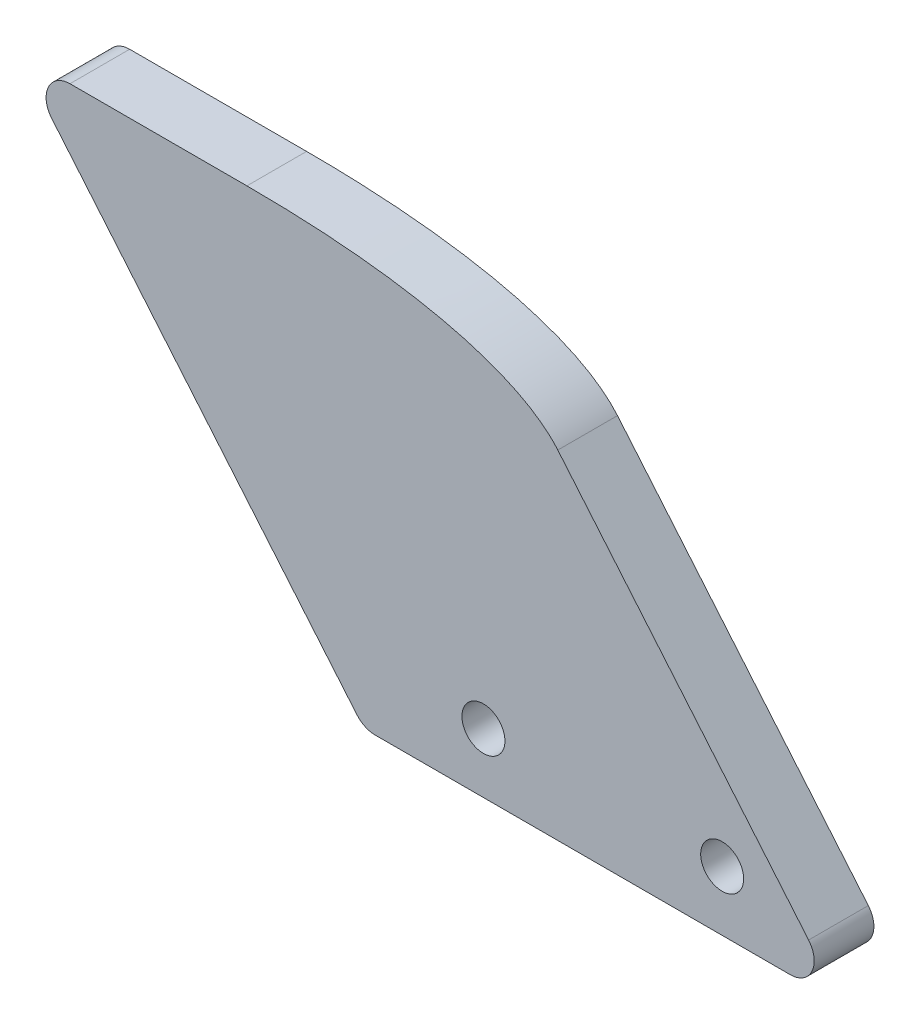
ISO-10303-21;
HEADER;
FILE_DESCRIPTION(('STEP AP214'),'2;1');
FILE_NAME('part.step','',(''),(''),'','','');
FILE_SCHEMA(('AUTOMOTIVE_DESIGN { 1 0 10303 214 1 1 1 1 }'));
ENDSEC;
DATA;
#1=APPLICATION_CONTEXT('core data for automotive mechanical design processes');
#2=APPLICATION_PROTOCOL_DEFINITION('international standard','automotive_design',2000,#1);
#3=PRODUCT_CONTEXT('',#1,'mechanical');
#4=PRODUCT('Part','Part','',(#3));
#5=PRODUCT_RELATED_PRODUCT_CATEGORY('part','',(#4));
#6=PRODUCT_DEFINITION_FORMATION('','',#4);
#7=PRODUCT_DEFINITION_CONTEXT('part definition',#1,'design');
#8=PRODUCT_DEFINITION('design','',#6,#7);
#9=PRODUCT_DEFINITION_SHAPE('','',#8);
#10=(LENGTH_UNIT() NAMED_UNIT(*) SI_UNIT(.MILLI.,.METRE.));
#11=(NAMED_UNIT(*) PLANE_ANGLE_UNIT() SI_UNIT($,.RADIAN.));
#12=(NAMED_UNIT(*) SI_UNIT($,.STERADIAN.) SOLID_ANGLE_UNIT());
#13=UNCERTAINTY_MEASURE_WITH_UNIT(LENGTH_MEASURE(1.E-05),#10,'distance_accuracy_value','');
#14=(GEOMETRIC_REPRESENTATION_CONTEXT(3) GLOBAL_UNCERTAINTY_ASSIGNED_CONTEXT((#13)) GLOBAL_UNIT_ASSIGNED_CONTEXT((#10,
#11,#12)) REPRESENTATION_CONTEXT('',''));
#15=CARTESIAN_POINT('',(0.,0.,0.));
#16=DIRECTION('',(0.,0.,1.));
#17=DIRECTION('',(1.,0.,0.));
#18=AXIS2_PLACEMENT_3D('',#15,#16,#17);
#19=CARTESIAN_POINT('',(36.7353118935856,-43.7794399242497,6.35));
#20=DIRECTION('',(0.766044443118979,0.642787609686538,0.));
#21=DIRECTION('',(-0.642787609686538,0.766044443118979,0.));
#22=AXIS2_PLACEMENT_3D('',#19,#20,#21);
#23=PLANE('',#22);
#24=DIRECTION('',(0.642787609686538,-0.766044443118979,0.));
#25=VECTOR('',#24,1.);
#26=CARTESIAN_POINT('',(36.7353118935856,-43.7794399242497,6.35));
#27=LINE('',#26,#25);
#28=CARTESIAN_POINT('',(3.50129469257206,-4.1726805286038,6.35));
#29=VERTEX_POINT('',#28);
#30=CARTESIAN_POINT('',(35.9739804597771,-42.8721204528535,6.35));
#31=VERTEX_POINT('',#30);
#32=EDGE_CURVE('E148',#29,#31,#27,.T.);
#33=ORIENTED_EDGE('',*,*,#32,.F.);
#34=DIRECTION('',(0.,0.,-1.));
#35=VECTOR('',#34,1.);
#36=CARTESIAN_POINT('',(3.50129469257206,-4.1726805286038,6.35));
#37=LINE('',#36,#35);
#38=CARTESIAN_POINT('',(3.50129469257206,-4.1726805286038,0.));
#39=VERTEX_POINT('',#38);
#40=EDGE_CURVE('E57',#29,#39,#37,.T.);
#41=ORIENTED_EDGE('',*,*,#40,.T.);
#42=DIRECTION('',(0.642787609686538,-0.766044443118979,0.));
#43=VECTOR('',#42,1.);
#44=CARTESIAN_POINT('',(36.7353118935856,-43.7794399242497,0.));
#45=LINE('',#44,#43);
#46=CARTESIAN_POINT('',(35.9739804597771,-42.8721204528535,0.));
#47=VERTEX_POINT('',#46);
#48=EDGE_CURVE('E168',#39,#47,#45,.T.);
#49=ORIENTED_EDGE('',*,*,#48,.T.);
#50=DIRECTION('',(0.,0.,-1.));
#51=VECTOR('',#50,1.);
#52=CARTESIAN_POINT('',(35.9739804597771,-42.8721204528535,6.35));
#53=LINE('',#52,#51);
#54=EDGE_CURVE('E64',#47,#31,#53,.F.);
#55=ORIENTED_EDGE('',*,*,#54,.T.);
#56=EDGE_LOOP('',(#33,#41,#49,#55));
#57=FACE_BOUND('',#56,.T.);
#58=ADVANCED_FACE('F48',(#57),#23,.F.);
#59=CARTESIAN_POINT('',(87.5353118935856,-43.7794399242497,6.35));
#60=DIRECTION('',(0.,1.,0.));
#61=DIRECTION('',(-1.,0.,0.));
#62=AXIS2_PLACEMENT_3D('',#59,#60,#61);
#63=PLANE('',#62);
#64=DIRECTION('',(1.,0.,0.));
#65=VECTOR('',#64,1.);
#66=CARTESIAN_POINT('',(87.5353118935856,-43.7794399242497,0.));
#67=LINE('',#66,#65);
#68=CARTESIAN_POINT('',(37.9197333452993,-43.7794399242497,0.));
#69=VERTEX_POINT('',#68);
#70=CARTESIAN_POINT('',(82.0882643154914,-43.7794399242497,0.));
#71=VERTEX_POINT('',#70);
#72=EDGE_CURVE('E155',#69,#71,#67,.T.);
#73=ORIENTED_EDGE('',*,*,#72,.T.);
#74=DIRECTION('',(0.,0.,-1.));
#75=VECTOR('',#74,1.);
#76=CARTESIAN_POINT('',(82.0882643154914,-43.7794399242497,6.35));
#77=LINE('',#76,#75);
#78=CARTESIAN_POINT('',(82.0882643154914,-43.7794399242497,6.35));
#79=VERTEX_POINT('',#78);
#80=EDGE_CURVE('E198',#71,#79,#77,.F.);
#81=ORIENTED_EDGE('',*,*,#80,.T.);
#82=DIRECTION('',(1.,0.,0.));
#83=VECTOR('',#82,1.);
#84=CARTESIAN_POINT('',(87.5353118935856,-43.7794399242497,6.35));
#85=LINE('',#84,#83);
#86=CARTESIAN_POINT('',(37.9197333452993,-43.7794399242497,6.35));
#87=VERTEX_POINT('',#86);
#88=EDGE_CURVE('E153',#87,#79,#85,.T.);
#89=ORIENTED_EDGE('',*,*,#88,.F.);
#90=DIRECTION('',(0.,0.,-1.));
#91=VECTOR('',#90,1.);
#92=CARTESIAN_POINT('',(37.9197333452993,-43.7794399242497,6.35));
#93=LINE('',#92,#91);
#94=EDGE_CURVE('E194',#87,#69,#93,.T.);
#95=ORIENTED_EDGE('',*,*,#94,.T.);
#96=EDGE_LOOP('',(#73,#81,#89,#95));
#97=FACE_BOUND('',#96,.T.);
#98=ADVANCED_FACE('F220',(#97),#63,.F.);
#99=CARTESIAN_POINT('',(50.8,0.,6.35));
#100=DIRECTION('',(-0.766044443118979,-0.642787609686538,0.));
#101=DIRECTION('',(0.642787609686538,-0.766044443118979,0.));
#102=AXIS2_PLACEMENT_3D('',#99,#100,#101);
#103=PLANE('',#102);
#104=DIRECTION('',(-0.642787609686538,0.766044443118979,0.));
#105=VECTOR('',#104,1.);
#106=CARTESIAN_POINT('',(50.8,0.,6.35));
#107=LINE('',#106,#105);
#108=CARTESIAN_POINT('',(84.0340172010136,-39.6067593956459,6.35));
#109=VERTEX_POINT('',#108);
#110=CARTESIAN_POINT('',(57.3486951851738,-7.8044310137353,6.35));
#111=VERTEX_POINT('',#110);
#112=EDGE_CURVE('E162',#109,#111,#107,.T.);
#113=ORIENTED_EDGE('',*,*,#112,.F.);
#114=DIRECTION('',(0.,0.,-1.));
#115=VECTOR('',#114,1.);
#116=CARTESIAN_POINT('',(84.0340172010136,-39.6067593956459,6.35));
#117=LINE('',#116,#115);
#118=CARTESIAN_POINT('',(84.0340172010136,-39.6067593956459,0.));
#119=VERTEX_POINT('',#118);
#120=EDGE_CURVE('E181',#109,#119,#117,.T.);
#121=ORIENTED_EDGE('',*,*,#120,.T.);
#122=DIRECTION('',(-0.642787609686538,0.766044443118979,0.));
#123=VECTOR('',#122,1.);
#124=CARTESIAN_POINT('',(50.8,0.,0.));
#125=LINE('',#124,#123);
#126=CARTESIAN_POINT('',(57.3486951851738,-7.80443101373529,0.));
#127=VERTEX_POINT('',#126);
#128=EDGE_CURVE('E149',#119,#127,#125,.T.);
#129=ORIENTED_EDGE('',*,*,#128,.T.);
#130=CARTESIAN_POINT('',(57.3486951851738,-7.80443101373529,6.6675));
#131=CARTESIAN_POINT('',(57.3486951851738,-7.80443101373529,4.33916666666666));
#132=CARTESIAN_POINT('',(57.3486951851738,-7.80443101373529,2.01083333333333));
#133=CARTESIAN_POINT('',(57.3486951851738,-7.80443101373529,-0.317499999999999));
#134=(BOUNDED_CURVE() B_SPLINE_CURVE(3,(#130,#131,#132,#133),.UNSPECIFIED.,.F.,
.F.) B_SPLINE_CURVE_WITH_KNOTS((4,4),(-0.0003175,0.0066675),
.UNSPECIFIED.) CURVE() GEOMETRIC_REPRESENTATION_ITEM() RATIONAL_B_SPLINE_CURVE((1.,1.,1.,1.)) REPRESENTATION_ITEM(''));
#135=EDGE_CURVE('E124',#127,#111,#134,.F.);
#136=ORIENTED_EDGE('',*,*,#135,.T.);
#137=EDGE_LOOP('',(#113,#121,#129,#136));
#138=FACE_BOUND('',#137,.T.);
#139=ADVANCED_FACE('F272',(#138),#103,.F.);
#140=CARTESIAN_POINT('',(0.,0.,6.35));
#141=DIRECTION('',(0.,-1.,0.));
#142=DIRECTION('',(0.,0.,-1.));
#143=AXIS2_PLACEMENT_3D('',#140,#141,#142);
#144=PLANE('',#143);
#145=DIRECTION('',(-1.,0.,0.));
#146=VECTOR('',#145,1.);
#147=CARTESIAN_POINT('',(0.,0.,0.));
#148=LINE('',#147,#146);
#149=CARTESIAN_POINT('',(24.2708961312963,0.,0.));
#150=VERTEX_POINT('',#149);
#151=CARTESIAN_POINT('',(5.44704757809427,0.,0.));
#152=VERTEX_POINT('',#151);
#153=EDGE_CURVE('E138',#150,#152,#148,.T.);
#154=ORIENTED_EDGE('',*,*,#153,.T.);
#155=DIRECTION('',(0.,0.,-1.));
#156=VECTOR('',#155,1.);
#157=CARTESIAN_POINT('',(5.44704757809427,0.,6.35));
#158=LINE('',#157,#156);
#159=CARTESIAN_POINT('',(5.44704757809427,0.,6.35));
#160=VERTEX_POINT('',#159);
#161=EDGE_CURVE('E12',#152,#160,#158,.F.);
#162=ORIENTED_EDGE('',*,*,#161,.T.);
#163=DIRECTION('',(-1.,0.,0.));
#164=VECTOR('',#163,1.);
#165=CARTESIAN_POINT('',(0.,0.,6.35));
#166=LINE('',#165,#164);
#167=CARTESIAN_POINT('',(24.2708961312963,0.,6.35));
#168=VERTEX_POINT('',#167);
#169=EDGE_CURVE('E140',#168,#160,#166,.T.);
#170=ORIENTED_EDGE('',*,*,#169,.F.);
#171=CARTESIAN_POINT('',(24.2708961312963,0.,-0.317499999999999));
#172=CARTESIAN_POINT('',(24.2708961312963,0.,2.01083333333333));
#173=CARTESIAN_POINT('',(24.2708961312963,0.,4.33916666666666));
#174=CARTESIAN_POINT('',(24.2708961312963,0.,6.6675));
#175=(BOUNDED_CURVE() B_SPLINE_CURVE(3,(#171,#172,#173,#174),.UNSPECIFIED.,.F.,
.F.) B_SPLINE_CURVE_WITH_KNOTS((4,4),(-0.0003175,0.0066675),
.UNSPECIFIED.) CURVE() GEOMETRIC_REPRESENTATION_ITEM() RATIONAL_B_SPLINE_CURVE((1.,1.,1.,1.)) REPRESENTATION_ITEM(''));
#176=EDGE_CURVE('E121',#168,#150,#175,.F.);
#177=ORIENTED_EDGE('',*,*,#176,.T.);
#178=EDGE_LOOP('',(#154,#162,#170,#177));
#179=FACE_BOUND('',#178,.T.);
#180=ADVANCED_FACE('F137',(#179),#144,.F.);
#181=CARTESIAN_POINT('',(0.,0.,6.35));
#182=DIRECTION('',(0.,0.,-1.));
#183=DIRECTION('',(-1.,0.,0.));
#184=AXIS2_PLACEMENT_3D('',#181,#182,#183);
#185=PLANE('',#184);
#186=CARTESIAN_POINT('',(49.4353118935856,-37.4294399242497,6.35));
#187=DIRECTION('',(0.,0.,1.));
#188=DIRECTION('',(1.,0.,0.));
#189=AXIS2_PLACEMENT_3D('',#186,#187,#188);
#190=CIRCLE('',#189,2.28599999999999);
#191=CARTESIAN_POINT('',(51.7213118935856,-37.4294399242497,6.35));
#192=VERTEX_POINT('',#191);
#193=EDGE_CURVE('E234',#192,#192,#190,.T.);
#194=ORIENTED_EDGE('',*,*,#193,.F.);
#195=EDGE_LOOP('',(#194));
#196=FACE_BOUND('',#195,.T.);
#197=CARTESIAN_POINT('',(74.8353118935856,-37.4294399242497,6.35));
#198=DIRECTION('',(0.,0.,1.));
#199=DIRECTION('',(1.,0.,0.));
#200=AXIS2_PLACEMENT_3D('',#197,#198,#199);
#201=CIRCLE('',#200,2.28599999999999);
#202=CARTESIAN_POINT('',(77.1213118935856,-37.4294399242497,6.35));
#203=VERTEX_POINT('',#202);
#204=EDGE_CURVE('E230',#203,#203,#201,.T.);
#205=ORIENTED_EDGE('',*,*,#204,.F.);
#206=EDGE_LOOP('',(#205));
#207=FACE_BOUND('',#206,.T.);
#208=ORIENTED_EDGE('',*,*,#88,.T.);
#209=CARTESIAN_POINT('',(82.0882643154914,-41.2394399242497,6.35));
#210=DIRECTION('',(0.,0.,-1.));
#211=DIRECTION('',(-1.,0.,0.));
#212=AXIS2_PLACEMENT_3D('',#209,#210,#211);
#213=CIRCLE('',#212,2.54);
#214=EDGE_CURVE('E206',#79,#109,#213,.F.);
#215=ORIENTED_EDGE('',*,*,#214,.T.);
#216=ORIENTED_EDGE('',*,*,#112,.T.);
#217=CARTESIAN_POINT('',(24.2708961312963,0.,6.35));
#218=CARTESIAN_POINT('',(50.8,0.,6.35));
#219=CARTESIAN_POINT('',(57.3486951851738,-7.80443101373529,6.35));
#220=(BOUNDED_CURVE() B_SPLINE_CURVE(2,(#217,#218,#219),.UNSPECIFIED.,.F.,
.F.) B_SPLINE_CURVE_WITH_KNOTS((3,3),(0.,1.),
.UNSPECIFIED.) CURVE() GEOMETRIC_REPRESENTATION_ITEM() RATIONAL_B_SPLINE_CURVE((1.,
0.90630778703665,1.)) REPRESENTATION_ITEM(''));
#221=EDGE_CURVE('E186',#111,#168,#220,.F.);
#222=ORIENTED_EDGE('',*,*,#221,.T.);
#223=ORIENTED_EDGE('',*,*,#169,.T.);
#224=CARTESIAN_POINT('',(5.44704757809427,-2.54,6.35));
#225=DIRECTION('',(0.,0.,-1.));
#226=DIRECTION('',(-1.,0.,0.));
#227=AXIS2_PLACEMENT_3D('',#224,#225,#226);
#228=CIRCLE('',#227,2.54);
#229=EDGE_CURVE('E71',#160,#29,#228,.F.);
#230=ORIENTED_EDGE('',*,*,#229,.T.);
#231=ORIENTED_EDGE('',*,*,#32,.T.);
#232=CARTESIAN_POINT('',(37.9197333452993,-41.2394399242497,6.35));
#233=DIRECTION('',(0.,0.,-1.));
#234=DIRECTION('',(-1.,0.,0.));
#235=AXIS2_PLACEMENT_3D('',#232,#233,#234);
#236=CIRCLE('',#235,2.54);
#237=EDGE_CURVE('E201',#31,#87,#236,.F.);
#238=ORIENTED_EDGE('',*,*,#237,.T.);
#239=EDGE_LOOP('',(#208,#215,#216,#222,#223,#230,#231,#238));
#240=FACE_BOUND('',#239,.T.);
#241=ADVANCED_FACE('F251',(#196,#207,#240),#185,.F.);
#242=CARTESIAN_POINT('',(0.,0.,0.));
#243=DIRECTION('',(0.,0.,-1.));
#244=DIRECTION('',(-1.,0.,0.));
#245=AXIS2_PLACEMENT_3D('',#242,#243,#244);
#246=PLANE('',#245);
#247=CARTESIAN_POINT('',(49.4353118935856,-37.4294399242497,0.));
#248=DIRECTION('',(0.,0.,1.));
#249=DIRECTION('',(1.,0.,0.));
#250=AXIS2_PLACEMENT_3D('',#247,#248,#249);
#251=CIRCLE('',#250,2.28599999999999);
#252=CARTESIAN_POINT('',(51.7213118935856,-37.4294399242497,0.));
#253=VERTEX_POINT('',#252);
#254=EDGE_CURVE('E171',#253,#253,#251,.T.);
#255=ORIENTED_EDGE('',*,*,#254,.T.);
#256=EDGE_LOOP('',(#255));
#257=FACE_BOUND('',#256,.T.);
#258=CARTESIAN_POINT('',(74.8353118935856,-37.4294399242497,0.));
#259=DIRECTION('',(0.,0.,1.));
#260=DIRECTION('',(1.,0.,0.));
#261=AXIS2_PLACEMENT_3D('',#258,#259,#260);
#262=CIRCLE('',#261,2.28599999999999);
#263=CARTESIAN_POINT('',(77.1213118935856,-37.4294399242497,0.));
#264=VERTEX_POINT('',#263);
#265=EDGE_CURVE('E226',#264,#264,#262,.T.);
#266=ORIENTED_EDGE('',*,*,#265,.T.);
#267=EDGE_LOOP('',(#266));
#268=FACE_BOUND('',#267,.T.);
#269=ORIENTED_EDGE('',*,*,#128,.F.);
#270=CARTESIAN_POINT('',(82.0882643154914,-41.2394399242497,0.));
#271=DIRECTION('',(0.,0.,-1.));
#272=DIRECTION('',(-1.,0.,0.));
#273=AXIS2_PLACEMENT_3D('',#270,#271,#272);
#274=CIRCLE('',#273,2.54);
#275=EDGE_CURVE('E191',#119,#71,#274,.T.);
#276=ORIENTED_EDGE('',*,*,#275,.T.);
#277=ORIENTED_EDGE('',*,*,#72,.F.);
#278=CARTESIAN_POINT('',(37.9197333452993,-41.2394399242497,0.));
#279=DIRECTION('',(0.,0.,-1.));
#280=DIRECTION('',(-1.,0.,0.));
#281=AXIS2_PLACEMENT_3D('',#278,#279,#280);
#282=CIRCLE('',#281,2.54);
#283=EDGE_CURVE('E185',#69,#47,#282,.T.);
#284=ORIENTED_EDGE('',*,*,#283,.T.);
#285=ORIENTED_EDGE('',*,*,#48,.F.);
#286=CARTESIAN_POINT('',(5.44704757809427,-2.54,0.));
#287=DIRECTION('',(0.,0.,-1.));
#288=DIRECTION('',(-1.,0.,0.));
#289=AXIS2_PLACEMENT_3D('',#286,#287,#288);
#290=CIRCLE('',#289,2.54);
#291=EDGE_CURVE('E146',#39,#152,#290,.T.);
#292=ORIENTED_EDGE('',*,*,#291,.T.);
#293=ORIENTED_EDGE('',*,*,#153,.F.);
#294=CARTESIAN_POINT('',(57.3486951851738,-7.80443101373529,0.));
#295=CARTESIAN_POINT('',(50.8,0.,0.));
#296=CARTESIAN_POINT('',(24.2708961312963,0.,0.));
#297=(BOUNDED_CURVE() B_SPLINE_CURVE(2,(#294,#295,#296),.UNSPECIFIED.,.F.,
.F.) B_SPLINE_CURVE_WITH_KNOTS((3,3),(0.,1.),
.UNSPECIFIED.) CURVE() GEOMETRIC_REPRESENTATION_ITEM() RATIONAL_B_SPLINE_CURVE((1.,
0.90630778703665,1.)) REPRESENTATION_ITEM(''));
#298=EDGE_CURVE('E116',#150,#127,#297,.F.);
#299=ORIENTED_EDGE('',*,*,#298,.T.);
#300=EDGE_LOOP('',(#269,#276,#277,#284,#285,#292,#293,#299));
#301=FACE_BOUND('',#300,.T.);
#302=ADVANCED_FACE('F144',(#257,#268,#301),#246,.T.);
#303=CARTESIAN_POINT('',(74.8353118935856,-37.4294399242497,0.));
#304=DIRECTION('',(0.,0.,1.));
#305=DIRECTION('',(1.,0.,0.));
#306=AXIS2_PLACEMENT_3D('',#303,#304,#305);
#307=CYLINDRICAL_SURFACE('',#306,2.28599999999999);
#308=ORIENTED_EDGE('',*,*,#265,.F.);
#309=EDGE_LOOP('',(#308));
#310=FACE_BOUND('',#309,.T.);
#311=ORIENTED_EDGE('',*,*,#204,.T.);
#312=EDGE_LOOP('',(#311));
#313=FACE_BOUND('',#312,.T.);
#314=ADVANCED_FACE('F247',(#310,#313),#307,.F.);
#315=CARTESIAN_POINT('',(49.4353118935856,-37.4294399242497,0.));
#316=DIRECTION('',(0.,0.,1.));
#317=DIRECTION('',(1.,0.,0.));
#318=AXIS2_PLACEMENT_3D('',#315,#316,#317);
#319=CYLINDRICAL_SURFACE('',#318,2.28599999999999);
#320=ORIENTED_EDGE('',*,*,#254,.F.);
#321=EDGE_LOOP('',(#320));
#322=FACE_BOUND('',#321,.T.);
#323=ORIENTED_EDGE('',*,*,#193,.T.);
#324=EDGE_LOOP('',(#323));
#325=FACE_BOUND('',#324,.T.);
#326=ADVANCED_FACE('F244',(#322,#325),#319,.F.);
#327=CARTESIAN_POINT('',(24.2708961312963,0.,6.6675));
#328=CARTESIAN_POINT('',(24.2708961312963,0.,4.33916666666666));
#329=CARTESIAN_POINT('',(24.2708961312963,0.,2.01083333333333));
#330=CARTESIAN_POINT('',(24.2708961312963,0.,-0.317499999999999));
#331=CARTESIAN_POINT('',(50.8,0.,6.6675));
#332=CARTESIAN_POINT('',(50.8,0.,4.33916666666666));
#333=CARTESIAN_POINT('',(50.8,0.,2.01083333333333));
#334=CARTESIAN_POINT('',(50.8,0.,-0.317499999999999));
#335=CARTESIAN_POINT('',(57.3486951851738,-7.80443101373529,6.6675));
#336=CARTESIAN_POINT('',(57.3486951851738,-7.80443101373529,4.33916666666666));
#337=CARTESIAN_POINT('',(57.3486951851738,-7.80443101373529,2.01083333333333));
#338=CARTESIAN_POINT('',(57.3486951851738,-7.80443101373529,-0.317499999999999));
#339=(BOUNDED_SURFACE() B_SPLINE_SURFACE(2,3,((#327,#328,#329,#330),(#331,#332,#333,#334),(#335,
#336,#337,#338)),.UNSPECIFIED.,.F.,.F.,.F.) B_SPLINE_SURFACE_WITH_KNOTS((3,3),(4,4),(0.,1.),
(-0.0003175,0.0066675),
.UNSPECIFIED.) GEOMETRIC_REPRESENTATION_ITEM() RATIONAL_B_SPLINE_SURFACE(((1.,1.,1.,1.),
(0.90630778703665,0.90630778703665,0.90630778703665,0.90630778703665),(1.,1.,1.,1.))) REPRESENTATION_ITEM('') SURFACE());
#340=ORIENTED_EDGE('',*,*,#221,.F.);
#341=ORIENTED_EDGE('',*,*,#135,.F.);
#342=ORIENTED_EDGE('',*,*,#298,.F.);
#343=ORIENTED_EDGE('',*,*,#176,.F.);
#344=EDGE_LOOP('',(#340,#341,#342,#343));
#345=FACE_BOUND('',#344,.T.);
#346=ADVANCED_FACE('F120',(#345),#339,.T.);
#347=CARTESIAN_POINT('',(82.0882643154914,-41.2394399242497,6.35));
#348=DIRECTION('',(0.,0.,-1.));
#349=DIRECTION('',(-1.,0.,0.));
#350=AXIS2_PLACEMENT_3D('',#347,#348,#349);
#351=CYLINDRICAL_SURFACE('',#350,2.54);
#352=ORIENTED_EDGE('',*,*,#214,.F.);
#353=ORIENTED_EDGE('',*,*,#80,.F.);
#354=ORIENTED_EDGE('',*,*,#275,.F.);
#355=ORIENTED_EDGE('',*,*,#120,.F.);
#356=EDGE_LOOP('',(#352,#353,#354,#355));
#357=FACE_BOUND('',#356,.T.);
#358=ADVANCED_FACE('F283',(#357),#351,.T.);
#359=CARTESIAN_POINT('',(5.44704757809427,-2.54,6.35));
#360=DIRECTION('',(0.,0.,-1.));
#361=DIRECTION('',(-1.,0.,0.));
#362=AXIS2_PLACEMENT_3D('',#359,#360,#361);
#363=CYLINDRICAL_SURFACE('',#362,2.54);
#364=ORIENTED_EDGE('',*,*,#229,.F.);
#365=ORIENTED_EDGE('',*,*,#161,.F.);
#366=ORIENTED_EDGE('',*,*,#291,.F.);
#367=ORIENTED_EDGE('',*,*,#40,.F.);
#368=EDGE_LOOP('',(#364,#365,#366,#367));
#369=FACE_BOUND('',#368,.T.);
#370=ADVANCED_FACE('F379',(#369),#363,.T.);
#371=CARTESIAN_POINT('',(37.9197333452993,-41.2394399242497,6.35));
#372=DIRECTION('',(0.,0.,-1.));
#373=DIRECTION('',(-1.,0.,0.));
#374=AXIS2_PLACEMENT_3D('',#371,#372,#373);
#375=CYLINDRICAL_SURFACE('',#374,2.54);
#376=ORIENTED_EDGE('',*,*,#237,.F.);
#377=ORIENTED_EDGE('',*,*,#54,.F.);
#378=ORIENTED_EDGE('',*,*,#283,.F.);
#379=ORIENTED_EDGE('',*,*,#94,.F.);
#380=EDGE_LOOP('',(#376,#377,#378,#379));
#381=FACE_BOUND('',#380,.T.);
#382=ADVANCED_FACE('F50',(#381),#375,.T.);
#383=CLOSED_SHELL('',(#58,#98,#139,#180,#241,#302,#314,#326,#346,#358,#370,#382));
#384=MANIFOLD_SOLID_BREP('B2',#383);
#385=ADVANCED_BREP_SHAPE_REPRESENTATION('',(#18,#384),#14);
#386=SHAPE_DEFINITION_REPRESENTATION(#9,#385);
ENDSEC;
END-ISO-10303-21;
